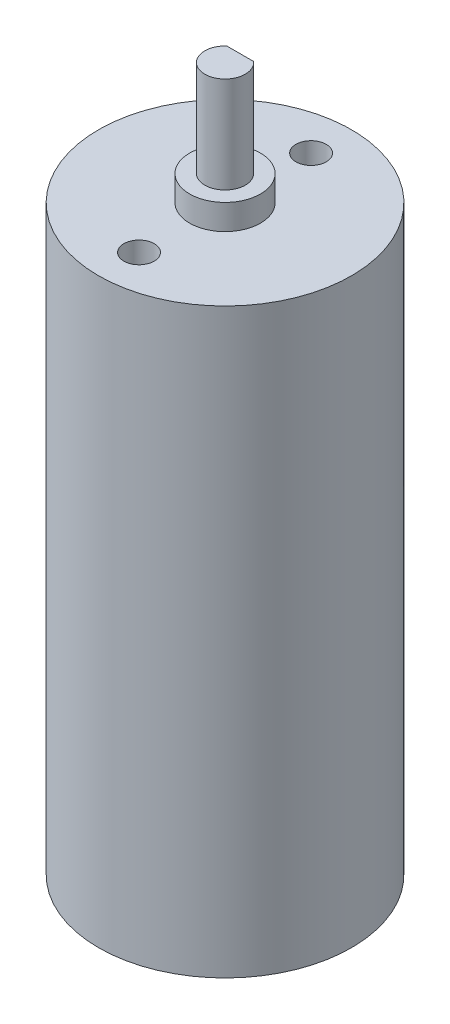
ISO-10303-21;
HEADER;
FILE_DESCRIPTION(('STEP AP214'),'2;1');
FILE_NAME('part.step','',(''),(''),'','','');
FILE_SCHEMA(('AUTOMOTIVE_DESIGN { 1 0 10303 214 1 1 1 1 }'));
ENDSEC;
DATA;
#1=APPLICATION_CONTEXT('core data for automotive mechanical design processes');
#2=APPLICATION_PROTOCOL_DEFINITION('international standard','automotive_design',2000,#1);
#3=PRODUCT_CONTEXT('',#1,'mechanical');
#4=PRODUCT('Part','Part','',(#3));
#5=PRODUCT_RELATED_PRODUCT_CATEGORY('part','',(#4));
#6=PRODUCT_DEFINITION_FORMATION('','',#4);
#7=PRODUCT_DEFINITION_CONTEXT('part definition',#1,'design');
#8=PRODUCT_DEFINITION('design','',#6,#7);
#9=PRODUCT_DEFINITION_SHAPE('','',#8);
#10=(LENGTH_UNIT() NAMED_UNIT(*) SI_UNIT(.MILLI.,.METRE.));
#11=(NAMED_UNIT(*) PLANE_ANGLE_UNIT() SI_UNIT($,.RADIAN.));
#12=(NAMED_UNIT(*) SI_UNIT($,.STERADIAN.) SOLID_ANGLE_UNIT());
#13=UNCERTAINTY_MEASURE_WITH_UNIT(LENGTH_MEASURE(1.E-05),#10,'distance_accuracy_value','');
#14=(GEOMETRIC_REPRESENTATION_CONTEXT(3) GLOBAL_UNCERTAINTY_ASSIGNED_CONTEXT((#13)) GLOBAL_UNIT_ASSIGNED_CONTEXT((#10,
#11,#12)) REPRESENTATION_CONTEXT('',''));
#15=CARTESIAN_POINT('',(0.,0.,0.));
#16=DIRECTION('',(0.,0.,1.));
#17=DIRECTION('',(1.,0.,0.));
#18=AXIS2_PLACEMENT_3D('',#15,#16,#17);
#19=CARTESIAN_POINT('',(0.,57.5,0.));
#20=DIRECTION('',(0.,-1.,0.));
#21=DIRECTION('',(0.,0.,-1.));
#22=AXIS2_PLACEMENT_3D('',#19,#20,#21);
#23=CYLINDRICAL_SURFACE('',#22,12.5);
#24=CARTESIAN_POINT('',(0.,57.5,0.));
#25=DIRECTION('',(0.,1.,0.));
#26=DIRECTION('',(0.,0.,1.));
#27=AXIS2_PLACEMENT_3D('',#24,#25,#26);
#28=CIRCLE('',#27,12.5);
#29=CARTESIAN_POINT('',(0.,57.5,12.5));
#30=VERTEX_POINT('',#29);
#31=EDGE_CURVE('E100',#30,#30,#28,.T.);
#32=ORIENTED_EDGE('',*,*,#31,.F.);
#33=EDGE_LOOP('',(#32));
#34=FACE_BOUND('',#33,.T.);
#35=CARTESIAN_POINT('',(0.,0.,0.));
#36=DIRECTION('',(0.,1.,0.));
#37=DIRECTION('',(0.,0.,1.));
#38=AXIS2_PLACEMENT_3D('',#35,#36,#37);
#39=CIRCLE('',#38,12.5);
#40=CARTESIAN_POINT('',(0.,0.,12.5));
#41=VERTEX_POINT('',#40);
#42=EDGE_CURVE('E48',#41,#41,#39,.T.);
#43=ORIENTED_EDGE('',*,*,#42,.T.);
#44=EDGE_LOOP('',(#43));
#45=FACE_BOUND('',#44,.T.);
#46=ADVANCED_FACE('F45',(#34,#45),#23,.T.);
#47=CARTESIAN_POINT('',(0.,57.5,0.));
#48=DIRECTION('',(0.,1.,0.));
#49=DIRECTION('',(0.,0.,1.));
#50=AXIS2_PLACEMENT_3D('',#47,#48,#49);
#51=PLANE('',#50);
#52=CARTESIAN_POINT('',(0.,57.5,-8.5));
#53=DIRECTION('',(0.,1.,0.));
#54=DIRECTION('',(0.,0.,1.));
#55=AXIS2_PLACEMENT_3D('',#52,#53,#54);
#56=CIRCLE('',#55,1.5);
#57=CARTESIAN_POINT('',(0.,57.5,-7.));
#58=VERTEX_POINT('',#57);
#59=EDGE_CURVE('E233',#58,#58,#56,.T.);
#60=ORIENTED_EDGE('',*,*,#59,.F.);
#61=EDGE_LOOP('',(#60));
#62=FACE_BOUND('',#61,.T.);
#63=CARTESIAN_POINT('',(0.,57.5,8.5));
#64=DIRECTION('',(0.,1.,0.));
#65=DIRECTION('',(0.,0.,1.));
#66=AXIS2_PLACEMENT_3D('',#63,#64,#65);
#67=CIRCLE('',#66,1.5);
#68=CARTESIAN_POINT('',(0.,57.5,10.));
#69=VERTEX_POINT('',#68);
#70=EDGE_CURVE('E237',#69,#69,#67,.T.);
#71=ORIENTED_EDGE('',*,*,#70,.F.);
#72=EDGE_LOOP('',(#71));
#73=FACE_BOUND('',#72,.T.);
#74=CARTESIAN_POINT('',(0.,57.5,0.));
#75=DIRECTION('',(0.,1.,0.));
#76=DIRECTION('',(0.,0.,1.));
#77=AXIS2_PLACEMENT_3D('',#74,#75,#76);
#78=CIRCLE('',#77,3.5);
#79=CARTESIAN_POINT('',(0.,57.5,3.5));
#80=VERTEX_POINT('',#79);
#81=EDGE_CURVE('E54',#80,#80,#78,.T.);
#82=ORIENTED_EDGE('',*,*,#81,.F.);
#83=EDGE_LOOP('',(#82));
#84=FACE_BOUND('',#83,.T.);
#85=ORIENTED_EDGE('',*,*,#31,.T.);
#86=EDGE_LOOP('',(#85));
#87=FACE_BOUND('',#86,.T.);
#88=ADVANCED_FACE('F113',(#62,#73,#84,#87),#51,.T.);
#89=CARTESIAN_POINT('',(0.,0.,0.));
#90=DIRECTION('',(0.,1.,0.));
#91=DIRECTION('',(0.,0.,1.));
#92=AXIS2_PLACEMENT_3D('',#89,#90,#91);
#93=PLANE('',#92);
#94=ORIENTED_EDGE('',*,*,#42,.F.);
#95=EDGE_LOOP('',(#94));
#96=FACE_BOUND('',#95,.T.);
#97=ADVANCED_FACE('F110',(#96),#93,.F.);
#98=CARTESIAN_POINT('',(0.,60.,0.));
#99=DIRECTION('',(0.,-1.,0.));
#100=DIRECTION('',(0.,0.,-1.));
#101=AXIS2_PLACEMENT_3D('',#98,#99,#100);
#102=CYLINDRICAL_SURFACE('',#101,3.5);
#103=CARTESIAN_POINT('',(0.,60.,0.));
#104=DIRECTION('',(0.,1.,0.));
#105=DIRECTION('',(0.,0.,1.));
#106=AXIS2_PLACEMENT_3D('',#103,#104,#105);
#107=CIRCLE('',#106,3.5);
#108=CARTESIAN_POINT('',(0.,60.,3.5));
#109=VERTEX_POINT('',#108);
#110=EDGE_CURVE('E91',#109,#109,#107,.T.);
#111=ORIENTED_EDGE('',*,*,#110,.F.);
#112=EDGE_LOOP('',(#111));
#113=FACE_BOUND('',#112,.T.);
#114=ORIENTED_EDGE('',*,*,#81,.T.);
#115=EDGE_LOOP('',(#114));
#116=FACE_BOUND('',#115,.T.);
#117=ADVANCED_FACE('F112',(#113,#116),#102,.T.);
#118=CARTESIAN_POINT('',(0.,60.,0.));
#119=DIRECTION('',(0.,1.,0.));
#120=DIRECTION('',(0.,0.,1.));
#121=AXIS2_PLACEMENT_3D('',#118,#119,#120);
#122=PLANE('',#121);
#123=CARTESIAN_POINT('',(0.,60.,0.));
#124=DIRECTION('',(0.,1.,0.));
#125=DIRECTION('',(0.,0.,1.));
#126=AXIS2_PLACEMENT_3D('',#123,#124,#125);
#127=CIRCLE('',#126,2.);
#128=CARTESIAN_POINT('',(0.,60.,2.));
#129=VERTEX_POINT('',#128);
#130=EDGE_CURVE('E11',#129,#129,#127,.T.);
#131=ORIENTED_EDGE('',*,*,#130,.F.);
#132=EDGE_LOOP('',(#131));
#133=FACE_BOUND('',#132,.T.);
#134=ORIENTED_EDGE('',*,*,#110,.T.);
#135=EDGE_LOOP('',(#134));
#136=FACE_BOUND('',#135,.T.);
#137=ADVANCED_FACE('F118',(#133,#136),#122,.T.);
#138=CARTESIAN_POINT('',(0.,69.5,0.));
#139=DIRECTION('',(0.,-1.,0.));
#140=DIRECTION('',(0.,0.,-1.));
#141=AXIS2_PLACEMENT_3D('',#138,#139,#140);
#142=CYLINDRICAL_SURFACE('',#141,2.);
#143=CARTESIAN_POINT('',(0.,69.5,0.));
#144=DIRECTION('',(0.,1.,0.));
#145=DIRECTION('',(0.,0.,1.));
#146=AXIS2_PLACEMENT_3D('',#143,#144,#145);
#147=CIRCLE('',#146,2.);
#148=CARTESIAN_POINT('',(-1.32287565553229,69.5,-1.5));
#149=VERTEX_POINT('',#148);
#150=CARTESIAN_POINT('',(1.32287565553229,69.5,-1.5));
#151=VERTEX_POINT('',#150);
#152=EDGE_CURVE('E86',#149,#151,#147,.T.);
#153=ORIENTED_EDGE('',*,*,#152,.F.);
#154=DIRECTION('',(0.,1.,0.));
#155=VECTOR('',#154,1.);
#156=CARTESIAN_POINT('',(-1.32287565553229,61.5,-1.5));
#157=LINE('',#156,#155);
#158=CARTESIAN_POINT('',(-1.32287565553229,61.5,-1.5));
#159=VERTEX_POINT('',#158);
#160=EDGE_CURVE('E62',#159,#149,#157,.T.);
#161=ORIENTED_EDGE('',*,*,#160,.F.);
#162=CARTESIAN_POINT('',(0.,61.5,0.));
#163=DIRECTION('',(0.,1.,0.));
#164=DIRECTION('',(0.,0.,1.));
#165=AXIS2_PLACEMENT_3D('',#162,#163,#164);
#166=CIRCLE('',#165,2.);
#167=CARTESIAN_POINT('',(1.32287565553229,61.5,-1.5));
#168=VERTEX_POINT('',#167);
#169=EDGE_CURVE('E79',#168,#159,#166,.T.);
#170=ORIENTED_EDGE('',*,*,#169,.F.);
#171=DIRECTION('',(0.,1.,0.));
#172=VECTOR('',#171,1.);
#173=CARTESIAN_POINT('',(1.32287565553229,61.5,-1.5));
#174=LINE('',#173,#172);
#175=EDGE_CURVE('E68',#168,#151,#174,.T.);
#176=ORIENTED_EDGE('',*,*,#175,.T.);
#177=EDGE_LOOP('',(#153,#161,#170,#176));
#178=FACE_BOUND('',#177,.T.);
#179=ORIENTED_EDGE('',*,*,#130,.T.);
#180=EDGE_LOOP('',(#179));
#181=FACE_BOUND('',#180,.T.);
#182=ADVANCED_FACE('F84',(#178,#181),#142,.T.);
#183=CARTESIAN_POINT('',(0.,69.5,0.));
#184=DIRECTION('',(0.,1.,0.));
#185=DIRECTION('',(0.,0.,1.));
#186=AXIS2_PLACEMENT_3D('',#183,#184,#185);
#187=PLANE('',#186);
#188=DIRECTION('',(1.,0.,0.));
#189=VECTOR('',#188,1.);
#190=CARTESIAN_POINT('',(0.,69.5,-1.5));
#191=LINE('',#190,#189);
#192=EDGE_CURVE('E73',#149,#151,#191,.T.);
#193=ORIENTED_EDGE('',*,*,#192,.F.);
#194=ORIENTED_EDGE('',*,*,#152,.T.);
#195=EDGE_LOOP('',(#193,#194));
#196=FACE_BOUND('',#195,.T.);
#197=ADVANCED_FACE('F89',(#196),#187,.T.);
#198=CARTESIAN_POINT('',(0.,61.5,-1.5));
#199=DIRECTION('',(0.,0.,1.));
#200=DIRECTION('',(1.,0.,0.));
#201=AXIS2_PLACEMENT_3D('',#198,#199,#200);
#202=PLANE('',#201);
#203=ORIENTED_EDGE('',*,*,#192,.T.);
#204=ORIENTED_EDGE('',*,*,#175,.F.);
#205=DIRECTION('',(1.,0.,0.));
#206=VECTOR('',#205,1.);
#207=CARTESIAN_POINT('',(0.,61.5,-1.5));
#208=LINE('',#207,#206);
#209=EDGE_CURVE('E249',#159,#168,#208,.T.);
#210=ORIENTED_EDGE('',*,*,#209,.F.);
#211=ORIENTED_EDGE('',*,*,#160,.T.);
#212=EDGE_LOOP('',(#203,#204,#210,#211));
#213=FACE_BOUND('',#212,.T.);
#214=ADVANCED_FACE('F74',(#213),#202,.F.);
#215=CARTESIAN_POINT('',(0.,61.5,0.));
#216=DIRECTION('',(0.,1.,0.));
#217=DIRECTION('',(0.,0.,1.));
#218=AXIS2_PLACEMENT_3D('',#215,#216,#217);
#219=PLANE('',#218);
#220=ORIENTED_EDGE('',*,*,#169,.T.);
#221=ORIENTED_EDGE('',*,*,#209,.T.);
#222=EDGE_LOOP('',(#220,#221));
#223=FACE_BOUND('',#222,.T.);
#224=ADVANCED_FACE('F180',(#223),#219,.T.);
#225=CARTESIAN_POINT('',(0.,52.5,8.5));
#226=DIRECTION('',(0.,1.,0.));
#227=DIRECTION('',(0.,0.,1.));
#228=AXIS2_PLACEMENT_3D('',#225,#226,#227);
#229=CYLINDRICAL_SURFACE('',#228,1.5);
#230=CARTESIAN_POINT('',(0.,52.5,8.5));
#231=DIRECTION('',(0.,1.,0.));
#232=DIRECTION('',(0.,0.,1.));
#233=AXIS2_PLACEMENT_3D('',#230,#231,#232);
#234=CIRCLE('',#233,1.5);
#235=CARTESIAN_POINT('',(0.,52.5,10.));
#236=VERTEX_POINT('',#235);
#237=EDGE_CURVE('E243',#236,#236,#234,.T.);
#238=ORIENTED_EDGE('',*,*,#237,.F.);
#239=EDGE_LOOP('',(#238));
#240=FACE_BOUND('',#239,.T.);
#241=ORIENTED_EDGE('',*,*,#70,.T.);
#242=EDGE_LOOP('',(#241));
#243=FACE_BOUND('',#242,.T.);
#244=ADVANCED_FACE('F188',(#240,#243),#229,.F.);
#245=CARTESIAN_POINT('',(0.,52.5,8.5));
#246=DIRECTION('',(0.,1.,0.));
#247=DIRECTION('',(0.,0.,1.));
#248=AXIS2_PLACEMENT_3D('',#245,#246,#247);
#249=PLANE('',#248);
#250=ORIENTED_EDGE('',*,*,#237,.T.);
#251=EDGE_LOOP('',(#250));
#252=FACE_BOUND('',#251,.T.);
#253=ADVANCED_FACE('F197',(#252),#249,.T.);
#254=CARTESIAN_POINT('',(0.,52.5,-8.5));
#255=DIRECTION('',(0.,1.,0.));
#256=DIRECTION('',(0.,0.,1.));
#257=AXIS2_PLACEMENT_3D('',#254,#255,#256);
#258=CYLINDRICAL_SURFACE('',#257,1.5);
#259=CARTESIAN_POINT('',(0.,52.5,-8.5));
#260=DIRECTION('',(0.,1.,0.));
#261=DIRECTION('',(0.,0.,1.));
#262=AXIS2_PLACEMENT_3D('',#259,#260,#261);
#263=CIRCLE('',#262,1.5);
#264=CARTESIAN_POINT('',(0.,52.5,-7.));
#265=VERTEX_POINT('',#264);
#266=EDGE_CURVE('E80',#265,#265,#263,.T.);
#267=ORIENTED_EDGE('',*,*,#266,.F.);
#268=EDGE_LOOP('',(#267));
#269=FACE_BOUND('',#268,.T.);
#270=ORIENTED_EDGE('',*,*,#59,.T.);
#271=EDGE_LOOP('',(#270));
#272=FACE_BOUND('',#271,.T.);
#273=ADVANCED_FACE('F207',(#269,#272),#258,.F.);
#274=CARTESIAN_POINT('',(0.,52.5,-8.5));
#275=DIRECTION('',(0.,1.,0.));
#276=DIRECTION('',(0.,0.,1.));
#277=AXIS2_PLACEMENT_3D('',#274,#275,#276);
#278=PLANE('',#277);
#279=ORIENTED_EDGE('',*,*,#266,.T.);
#280=EDGE_LOOP('',(#279));
#281=FACE_BOUND('',#280,.T.);
#282=ADVANCED_FACE('F217',(#281),#278,.T.);
#283=CLOSED_SHELL('',(#46,#88,#97,#117,#137,#182,#197,#214,#224,#244,#253,#273,#282));
#284=MANIFOLD_SOLID_BREP('B2',#283);
#285=ADVANCED_BREP_SHAPE_REPRESENTATION('',(#18,#284),#14);
#286=SHAPE_DEFINITION_REPRESENTATION(#9,#285);
ENDSEC;
END-ISO-10303-21;
